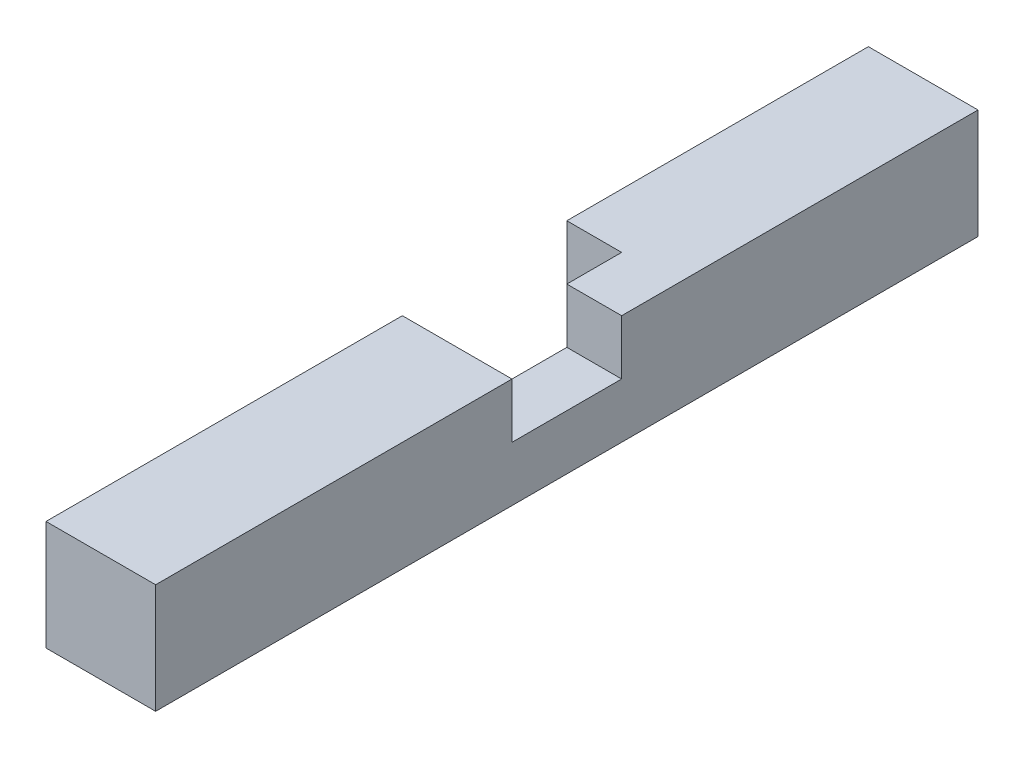
ISO-10303-21;
HEADER;
FILE_DESCRIPTION(('STEP AP214'),'2;1');
FILE_NAME('part.step','',(''),(''),'','','');
FILE_SCHEMA(('AUTOMOTIVE_DESIGN { 1 0 10303 214 1 1 1 1 }'));
ENDSEC;
DATA;
#1=APPLICATION_CONTEXT('core data for automotive mechanical design processes');
#2=APPLICATION_PROTOCOL_DEFINITION('international standard','automotive_design',2000,#1);
#3=PRODUCT_CONTEXT('',#1,'mechanical');
#4=PRODUCT('Part','Part','',(#3));
#5=PRODUCT_RELATED_PRODUCT_CATEGORY('part','',(#4));
#6=PRODUCT_DEFINITION_FORMATION('','',#4);
#7=PRODUCT_DEFINITION_CONTEXT('part definition',#1,'design');
#8=PRODUCT_DEFINITION('design','',#6,#7);
#9=PRODUCT_DEFINITION_SHAPE('','',#8);
#10=(LENGTH_UNIT() NAMED_UNIT(*) SI_UNIT(.MILLI.,.METRE.));
#11=(NAMED_UNIT(*) PLANE_ANGLE_UNIT() SI_UNIT($,.RADIAN.));
#12=(NAMED_UNIT(*) SI_UNIT($,.STERADIAN.) SOLID_ANGLE_UNIT());
#13=UNCERTAINTY_MEASURE_WITH_UNIT(LENGTH_MEASURE(1.E-05),#10,'distance_accuracy_value','');
#14=(GEOMETRIC_REPRESENTATION_CONTEXT(3) GLOBAL_UNCERTAINTY_ASSIGNED_CONTEXT((#13)) GLOBAL_UNIT_ASSIGNED_CONTEXT((#10,
#11,#12)) REPRESENTATION_CONTEXT('',''));
#15=CARTESIAN_POINT('',(0.,0.,0.));
#16=DIRECTION('',(0.,0.,1.));
#17=DIRECTION('',(1.,0.,0.));
#18=AXIS2_PLACEMENT_3D('',#15,#16,#17);
#19=CARTESIAN_POINT('',(-2.,2.,30.));
#20=DIRECTION('',(1.,0.,0.));
#21=DIRECTION('',(0.,1.,0.));
#22=AXIS2_PLACEMENT_3D('',#19,#20,#21);
#23=PLANE('',#22);
#24=DIRECTION('',(0.,-1.,0.));
#25=VECTOR('',#24,1.);
#26=CARTESIAN_POINT('',(-2.,0.,15.));
#27=LINE('',#26,#25);
#28=CARTESIAN_POINT('',(-2.,0.,15.));
#29=VERTEX_POINT('',#28);
#30=CARTESIAN_POINT('',(-2.,-2.,15.));
#31=VERTEX_POINT('',#30);
#32=EDGE_CURVE('E146',#29,#31,#27,.T.);
#33=ORIENTED_EDGE('',*,*,#32,.T.);
#34=DIRECTION('',(0.,0.,-1.));
#35=VECTOR('',#34,1.);
#36=CARTESIAN_POINT('',(-2.,-2.,30.));
#37=LINE('',#36,#35);
#38=CARTESIAN_POINT('',(-2.,-2.,30.));
#39=VERTEX_POINT('',#38);
#40=EDGE_CURVE('E141',#39,#31,#37,.T.);
#41=ORIENTED_EDGE('',*,*,#40,.F.);
#42=DIRECTION('',(0.,-1.,0.));
#43=VECTOR('',#42,1.);
#44=CARTESIAN_POINT('',(-2.,2.,30.));
#45=LINE('',#44,#43);
#46=CARTESIAN_POINT('',(-2.,2.,30.));
#47=VERTEX_POINT('',#46);
#48=EDGE_CURVE('E189',#47,#39,#45,.T.);
#49=ORIENTED_EDGE('',*,*,#48,.F.);
#50=DIRECTION('',(0.,0.,-1.));
#51=VECTOR('',#50,1.);
#52=CARTESIAN_POINT('',(-2.,2.,30.));
#53=LINE('',#52,#51);
#54=CARTESIAN_POINT('',(-2.,2.,17.));
#55=VERTEX_POINT('',#54);
#56=EDGE_CURVE('E207',#47,#55,#53,.T.);
#57=ORIENTED_EDGE('',*,*,#56,.T.);
#58=DIRECTION('',(0.,-1.,0.));
#59=VECTOR('',#58,1.);
#60=CARTESIAN_POINT('',(-2.,2.,17.));
#61=LINE('',#60,#59);
#62=CARTESIAN_POINT('',(-2.,0.,17.));
#63=VERTEX_POINT('',#62);
#64=EDGE_CURVE('E152',#55,#63,#61,.T.);
#65=ORIENTED_EDGE('',*,*,#64,.T.);
#66=DIRECTION('',(0.,0.,1.));
#67=VECTOR('',#66,1.);
#68=CARTESIAN_POINT('',(-2.,0.,13.));
#69=LINE('',#68,#67);
#70=EDGE_CURVE('E143',#29,#63,#69,.T.);
#71=ORIENTED_EDGE('',*,*,#70,.F.);
#72=EDGE_LOOP('',(#33,#41,#49,#57,#65,#71));
#73=FACE_BOUND('',#72,.T.);
#74=ADVANCED_FACE('F35',(#73),#23,.F.);
#75=CARTESIAN_POINT('',(-2.,-2.,30.));
#76=DIRECTION('',(0.,1.,0.));
#77=DIRECTION('',(0.,0.,1.));
#78=AXIS2_PLACEMENT_3D('',#75,#76,#77);
#79=PLANE('',#78);
#80=DIRECTION('',(-1.,0.,0.));
#81=VECTOR('',#80,1.);
#82=CARTESIAN_POINT('',(0.,-2.,15.));
#83=LINE('',#82,#81);
#84=CARTESIAN_POINT('',(0.,-2.,15.));
#85=VERTEX_POINT('',#84);
#86=EDGE_CURVE('E133',#85,#31,#83,.T.);
#87=ORIENTED_EDGE('',*,*,#86,.F.);
#88=DIRECTION('',(0.,0.,1.));
#89=VECTOR('',#88,1.);
#90=CARTESIAN_POINT('',(0.,-2.,11.));
#91=LINE('',#90,#89);
#92=CARTESIAN_POINT('',(0.,-2.,11.));
#93=VERTEX_POINT('',#92);
#94=EDGE_CURVE('E123',#93,#85,#91,.T.);
#95=ORIENTED_EDGE('',*,*,#94,.F.);
#96=DIRECTION('',(-1.,0.,0.));
#97=VECTOR('',#96,1.);
#98=CARTESIAN_POINT('',(0.,-2.,11.));
#99=LINE('',#98,#97);
#100=CARTESIAN_POINT('',(-2.,-2.,11.));
#101=VERTEX_POINT('',#100);
#102=EDGE_CURVE('E177',#93,#101,#99,.T.);
#103=ORIENTED_EDGE('',*,*,#102,.T.);
#104=CARTESIAN_POINT('',(-2.,-2.,0.));
#105=VERTEX_POINT('',#104);
#106=EDGE_CURVE('E205',#101,#105,#37,.T.);
#107=ORIENTED_EDGE('',*,*,#106,.T.);
#108=DIRECTION('',(1.,0.,0.));
#109=VECTOR('',#108,1.);
#110=CARTESIAN_POINT('',(-2.,-2.,0.));
#111=LINE('',#110,#109);
#112=CARTESIAN_POINT('',(2.,-2.,0.));
#113=VERTEX_POINT('',#112);
#114=EDGE_CURVE('E187',#105,#113,#111,.T.);
#115=ORIENTED_EDGE('',*,*,#114,.T.);
#116=DIRECTION('',(0.,0.,-1.));
#117=VECTOR('',#116,1.);
#118=CARTESIAN_POINT('',(2.,-2.,30.));
#119=LINE('',#118,#117);
#120=CARTESIAN_POINT('',(2.,-2.,30.));
#121=VERTEX_POINT('',#120);
#122=EDGE_CURVE('E193',#121,#113,#119,.T.);
#123=ORIENTED_EDGE('',*,*,#122,.F.);
#124=DIRECTION('',(1.,0.,0.));
#125=VECTOR('',#124,1.);
#126=CARTESIAN_POINT('',(-2.,-2.,30.));
#127=LINE('',#126,#125);
#128=EDGE_CURVE('E191',#39,#121,#127,.T.);
#129=ORIENTED_EDGE('',*,*,#128,.F.);
#130=ORIENTED_EDGE('',*,*,#40,.T.);
#131=EDGE_LOOP('',(#87,#95,#103,#107,#115,#123,#129,#130));
#132=FACE_BOUND('',#131,.T.);
#133=ADVANCED_FACE('F138',(#132),#79,.F.);
#134=CARTESIAN_POINT('',(2.,0.,13.));
#135=DIRECTION('',(0.,-1.,0.));
#136=DIRECTION('',(1.,0.,0.));
#137=AXIS2_PLACEMENT_3D('',#134,#135,#136);
#138=PLANE('',#137);
#139=DIRECTION('',(-1.,0.,0.));
#140=VECTOR('',#139,1.);
#141=CARTESIAN_POINT('',(0.,0.,15.));
#142=LINE('',#141,#140);
#143=CARTESIAN_POINT('',(0.,0.,15.));
#144=VERTEX_POINT('',#143);
#145=EDGE_CURVE('E50',#144,#29,#142,.T.);
#146=ORIENTED_EDGE('',*,*,#145,.T.);
#147=ORIENTED_EDGE('',*,*,#70,.T.);
#148=DIRECTION('',(-1.,0.,0.));
#149=VECTOR('',#148,1.);
#150=CARTESIAN_POINT('',(2.,0.,17.));
#151=LINE('',#150,#149);
#152=CARTESIAN_POINT('',(2.,0.,17.));
#153=VERTEX_POINT('',#152);
#154=EDGE_CURVE('E167',#153,#63,#151,.T.);
#155=ORIENTED_EDGE('',*,*,#154,.F.);
#156=DIRECTION('',(0.,0.,1.));
#157=VECTOR('',#156,1.);
#158=CARTESIAN_POINT('',(2.,0.,13.));
#159=LINE('',#158,#157);
#160=CARTESIAN_POINT('',(2.,0.,13.));
#161=VERTEX_POINT('',#160);
#162=EDGE_CURVE('E151',#161,#153,#159,.T.);
#163=ORIENTED_EDGE('',*,*,#162,.F.);
#164=DIRECTION('',(-1.,0.,0.));
#165=VECTOR('',#164,1.);
#166=CARTESIAN_POINT('',(2.,0.,13.));
#167=LINE('',#166,#165);
#168=CARTESIAN_POINT('',(0.,0.,13.));
#169=VERTEX_POINT('',#168);
#170=EDGE_CURVE('E157',#161,#169,#167,.T.);
#171=ORIENTED_EDGE('',*,*,#170,.T.);
#172=DIRECTION('',(0.,0.,1.));
#173=VECTOR('',#172,1.);
#174=CARTESIAN_POINT('',(0.,0.,13.));
#175=LINE('',#174,#173);
#176=EDGE_CURVE('E135',#169,#144,#175,.T.);
#177=ORIENTED_EDGE('',*,*,#176,.T.);
#178=EDGE_LOOP('',(#146,#147,#155,#163,#171,#177));
#179=FACE_BOUND('',#178,.T.);
#180=ADVANCED_FACE('F239',(#179),#138,.F.);
#181=CARTESIAN_POINT('',(-2.,2.,30.));
#182=DIRECTION('',(0.,-1.,0.));
#183=DIRECTION('',(0.,0.,-1.));
#184=AXIS2_PLACEMENT_3D('',#181,#182,#183);
#185=PLANE('',#184);
#186=DIRECTION('',(-1.,0.,0.));
#187=VECTOR('',#186,1.);
#188=CARTESIAN_POINT('',(2.,2.,17.));
#189=LINE('',#188,#187);
#190=CARTESIAN_POINT('',(2.,2.,17.));
#191=VERTEX_POINT('',#190);
#192=EDGE_CURVE('E164',#191,#55,#189,.T.);
#193=ORIENTED_EDGE('',*,*,#192,.T.);
#194=ORIENTED_EDGE('',*,*,#56,.F.);
#195=DIRECTION('',(-1.,0.,0.));
#196=VECTOR('',#195,1.);
#197=CARTESIAN_POINT('',(-2.,2.,30.));
#198=LINE('',#197,#196);
#199=CARTESIAN_POINT('',(2.,2.,30.));
#200=VERTEX_POINT('',#199);
#201=EDGE_CURVE('E186',#200,#47,#198,.T.);
#202=ORIENTED_EDGE('',*,*,#201,.F.);
#203=DIRECTION('',(0.,0.,-1.));
#204=VECTOR('',#203,1.);
#205=CARTESIAN_POINT('',(2.,2.,30.));
#206=LINE('',#205,#204);
#207=EDGE_CURVE('E11',#200,#191,#206,.T.);
#208=ORIENTED_EDGE('',*,*,#207,.T.);
#209=EDGE_LOOP('',(#193,#194,#202,#208));
#210=FACE_BOUND('',#209,.T.);
#211=ADVANCED_FACE('F248',(#210),#185,.F.);
#212=ORIENTED_EDGE('',*,*,#106,.F.);
#213=DIRECTION('',(0.,-1.,0.));
#214=VECTOR('',#213,1.);
#215=CARTESIAN_POINT('',(-2.,2.,11.));
#216=LINE('',#215,#214);
#217=CARTESIAN_POINT('',(-2.,2.,11.));
#218=VERTEX_POINT('',#217);
#219=EDGE_CURVE('E163',#218,#101,#216,.T.);
#220=ORIENTED_EDGE('',*,*,#219,.F.);
#221=CARTESIAN_POINT('',(-2.,2.,0.));
#222=VERTEX_POINT('',#221);
#223=EDGE_CURVE('E206',#218,#222,#53,.T.);
#224=ORIENTED_EDGE('',*,*,#223,.T.);
#225=DIRECTION('',(0.,-1.,0.));
#226=VECTOR('',#225,1.);
#227=CARTESIAN_POINT('',(-2.,2.,0.));
#228=LINE('',#227,#226);
#229=EDGE_CURVE('E199',#222,#105,#228,.T.);
#230=ORIENTED_EDGE('',*,*,#229,.T.);
#231=EDGE_LOOP('',(#212,#220,#224,#230));
#232=FACE_BOUND('',#231,.T.);
#233=ADVANCED_FACE('F216',(#232),#23,.F.);
#234=CARTESIAN_POINT('',(2.,2.,30.));
#235=DIRECTION('',(-1.,0.,0.));
#236=DIRECTION('',(0.,-1.,0.));
#237=AXIS2_PLACEMENT_3D('',#234,#235,#236);
#238=PLANE('',#237);
#239=CARTESIAN_POINT('',(2.,2.,13.));
#240=VERTEX_POINT('',#239);
#241=CARTESIAN_POINT('',(2.,2.,0.));
#242=VERTEX_POINT('',#241);
#243=EDGE_CURVE('E43',#240,#242,#206,.T.);
#244=ORIENTED_EDGE('',*,*,#243,.F.);
#245=DIRECTION('',(0.,-1.,0.));
#246=VECTOR('',#245,1.);
#247=CARTESIAN_POINT('',(2.,2.,13.));
#248=LINE('',#247,#246);
#249=EDGE_CURVE('E148',#240,#161,#248,.T.);
#250=ORIENTED_EDGE('',*,*,#249,.T.);
#251=ORIENTED_EDGE('',*,*,#162,.T.);
#252=DIRECTION('',(0.,-1.,0.));
#253=VECTOR('',#252,1.);
#254=CARTESIAN_POINT('',(2.,2.,17.));
#255=LINE('',#254,#253);
#256=EDGE_CURVE('E155',#191,#153,#255,.T.);
#257=ORIENTED_EDGE('',*,*,#256,.F.);
#258=ORIENTED_EDGE('',*,*,#207,.F.);
#259=DIRECTION('',(0.,1.,0.));
#260=VECTOR('',#259,1.);
#261=CARTESIAN_POINT('',(2.,2.,30.));
#262=LINE('',#261,#260);
#263=EDGE_CURVE('E183',#121,#200,#262,.T.);
#264=ORIENTED_EDGE('',*,*,#263,.F.);
#265=ORIENTED_EDGE('',*,*,#122,.T.);
#266=DIRECTION('',(0.,1.,0.));
#267=VECTOR('',#266,1.);
#268=CARTESIAN_POINT('',(2.,2.,0.));
#269=LINE('',#268,#267);
#270=EDGE_CURVE('E181',#113,#242,#269,.T.);
#271=ORIENTED_EDGE('',*,*,#270,.T.);
#272=EDGE_LOOP('',(#244,#250,#251,#257,#258,#264,#265,#271));
#273=FACE_BOUND('',#272,.T.);
#274=ADVANCED_FACE('F37',(#273),#238,.F.);
#275=DIRECTION('',(0.,0.,-1.));
#276=VECTOR('',#275,1.);
#277=CARTESIAN_POINT('',(0.,2.,11.));
#278=LINE('',#277,#276);
#279=CARTESIAN_POINT('',(0.,2.,13.));
#280=VERTEX_POINT('',#279);
#281=CARTESIAN_POINT('',(0.,2.,11.));
#282=VERTEX_POINT('',#281);
#283=EDGE_CURVE('E175',#280,#282,#278,.T.);
#284=ORIENTED_EDGE('',*,*,#283,.F.);
#285=DIRECTION('',(-1.,0.,0.));
#286=VECTOR('',#285,1.);
#287=CARTESIAN_POINT('',(2.,2.,13.));
#288=LINE('',#287,#286);
#289=EDGE_CURVE('E161',#240,#280,#288,.T.);
#290=ORIENTED_EDGE('',*,*,#289,.F.);
#291=ORIENTED_EDGE('',*,*,#243,.T.);
#292=DIRECTION('',(-1.,0.,0.));
#293=VECTOR('',#292,1.);
#294=CARTESIAN_POINT('',(-2.,2.,0.));
#295=LINE('',#294,#293);
#296=EDGE_CURVE('E196',#242,#222,#295,.T.);
#297=ORIENTED_EDGE('',*,*,#296,.T.);
#298=ORIENTED_EDGE('',*,*,#223,.F.);
#299=DIRECTION('',(-1.,0.,0.));
#300=VECTOR('',#299,1.);
#301=CARTESIAN_POINT('',(0.,2.,11.));
#302=LINE('',#301,#300);
#303=EDGE_CURVE('E179',#282,#218,#302,.T.);
#304=ORIENTED_EDGE('',*,*,#303,.F.);
#305=EDGE_LOOP('',(#284,#290,#291,#297,#298,#304));
#306=FACE_BOUND('',#305,.T.);
#307=ADVANCED_FACE('F223',(#306),#185,.F.);
#308=CARTESIAN_POINT('',(0.,0.,30.));
#309=DIRECTION('',(0.,0.,1.));
#310=DIRECTION('',(1.,0.,0.));
#311=AXIS2_PLACEMENT_3D('',#308,#309,#310);
#312=PLANE('',#311);
#313=ORIENTED_EDGE('',*,*,#263,.T.);
#314=ORIENTED_EDGE('',*,*,#201,.T.);
#315=ORIENTED_EDGE('',*,*,#48,.T.);
#316=ORIENTED_EDGE('',*,*,#128,.T.);
#317=EDGE_LOOP('',(#313,#314,#315,#316));
#318=FACE_BOUND('',#317,.T.);
#319=ADVANCED_FACE('F235',(#318),#312,.T.);
#320=CARTESIAN_POINT('',(0.,0.,0.));
#321=DIRECTION('',(0.,0.,1.));
#322=DIRECTION('',(1.,0.,0.));
#323=AXIS2_PLACEMENT_3D('',#320,#321,#322);
#324=PLANE('',#323);
#325=ORIENTED_EDGE('',*,*,#270,.F.);
#326=ORIENTED_EDGE('',*,*,#114,.F.);
#327=ORIENTED_EDGE('',*,*,#229,.F.);
#328=ORIENTED_EDGE('',*,*,#296,.F.);
#329=EDGE_LOOP('',(#325,#326,#327,#328));
#330=FACE_BOUND('',#329,.T.);
#331=ADVANCED_FACE('F228',(#330),#324,.F.);
#332=CARTESIAN_POINT('',(0.,2.,11.));
#333=DIRECTION('',(0.,0.,-1.));
#334=DIRECTION('',(-1.,0.,0.));
#335=AXIS2_PLACEMENT_3D('',#332,#333,#334);
#336=PLANE('',#335);
#337=ORIENTED_EDGE('',*,*,#219,.T.);
#338=ORIENTED_EDGE('',*,*,#102,.F.);
#339=DIRECTION('',(0.,-1.,0.));
#340=VECTOR('',#339,1.);
#341=CARTESIAN_POINT('',(0.,2.,11.));
#342=LINE('',#341,#340);
#343=EDGE_CURVE('E58',#282,#93,#342,.T.);
#344=ORIENTED_EDGE('',*,*,#343,.F.);
#345=ORIENTED_EDGE('',*,*,#303,.T.);
#346=EDGE_LOOP('',(#337,#338,#344,#345));
#347=FACE_BOUND('',#346,.T.);
#348=ADVANCED_FACE('F265',(#347),#336,.F.);
#349=CARTESIAN_POINT('',(0.,0.,0.));
#350=DIRECTION('',(-1.,0.,0.));
#351=DIRECTION('',(0.,-1.,0.));
#352=AXIS2_PLACEMENT_3D('',#349,#350,#351);
#353=PLANE('',#352);
#354=ORIENTED_EDGE('',*,*,#343,.T.);
#355=ORIENTED_EDGE('',*,*,#94,.T.);
#356=DIRECTION('',(0.,-1.,0.));
#357=VECTOR('',#356,1.);
#358=CARTESIAN_POINT('',(0.,0.,15.));
#359=LINE('',#358,#357);
#360=EDGE_CURVE('E125',#144,#85,#359,.T.);
#361=ORIENTED_EDGE('',*,*,#360,.F.);
#362=ORIENTED_EDGE('',*,*,#176,.F.);
#363=DIRECTION('',(0.,1.,0.));
#364=VECTOR('',#363,1.);
#365=CARTESIAN_POINT('',(0.,2.,13.));
#366=LINE('',#365,#364);
#367=EDGE_CURVE('E130',#169,#280,#366,.T.);
#368=ORIENTED_EDGE('',*,*,#367,.T.);
#369=ORIENTED_EDGE('',*,*,#283,.T.);
#370=EDGE_LOOP('',(#354,#355,#361,#362,#368,#369));
#371=FACE_BOUND('',#370,.T.);
#372=ADVANCED_FACE('F124',(#371),#353,.T.);
#373=CARTESIAN_POINT('',(2.,2.,13.));
#374=DIRECTION('',(0.,0.,-1.));
#375=DIRECTION('',(-1.,0.,0.));
#376=AXIS2_PLACEMENT_3D('',#373,#374,#375);
#377=PLANE('',#376);
#378=ORIENTED_EDGE('',*,*,#367,.F.);
#379=ORIENTED_EDGE('',*,*,#170,.F.);
#380=ORIENTED_EDGE('',*,*,#249,.F.);
#381=ORIENTED_EDGE('',*,*,#289,.T.);
#382=EDGE_LOOP('',(#378,#379,#380,#381));
#383=FACE_BOUND('',#382,.T.);
#384=ADVANCED_FACE('F243',(#383),#377,.F.);
#385=CARTESIAN_POINT('',(2.,2.,17.));
#386=DIRECTION('',(0.,0.,-1.));
#387=DIRECTION('',(-1.,0.,0.));
#388=AXIS2_PLACEMENT_3D('',#385,#386,#387);
#389=PLANE('',#388);
#390=ORIENTED_EDGE('',*,*,#64,.F.);
#391=ORIENTED_EDGE('',*,*,#192,.F.);
#392=ORIENTED_EDGE('',*,*,#256,.T.);
#393=ORIENTED_EDGE('',*,*,#154,.T.);
#394=EDGE_LOOP('',(#390,#391,#392,#393));
#395=FACE_BOUND('',#394,.T.);
#396=ADVANCED_FACE('F246',(#395),#389,.T.);
#397=CARTESIAN_POINT('',(0.,0.,15.));
#398=DIRECTION('',(0.,0.,-1.));
#399=DIRECTION('',(-1.,0.,0.));
#400=AXIS2_PLACEMENT_3D('',#397,#398,#399);
#401=PLANE('',#400);
#402=ORIENTED_EDGE('',*,*,#32,.F.);
#403=ORIENTED_EDGE('',*,*,#145,.F.);
#404=ORIENTED_EDGE('',*,*,#360,.T.);
#405=ORIENTED_EDGE('',*,*,#86,.T.);
#406=EDGE_LOOP('',(#402,#403,#404,#405));
#407=FACE_BOUND('',#406,.T.);
#408=ADVANCED_FACE('F132',(#407),#401,.T.);
#409=CLOSED_SHELL('',(#74,#133,#180,#211,#233,#274,#307,#319,#331,#348,#372,#384,#396,#408));
#410=MANIFOLD_SOLID_BREP('B2',#409);
#411=ADVANCED_BREP_SHAPE_REPRESENTATION('',(#18,#410),#14);
#412=SHAPE_DEFINITION_REPRESENTATION(#9,#411);
ENDSEC;
END-ISO-10303-21;
